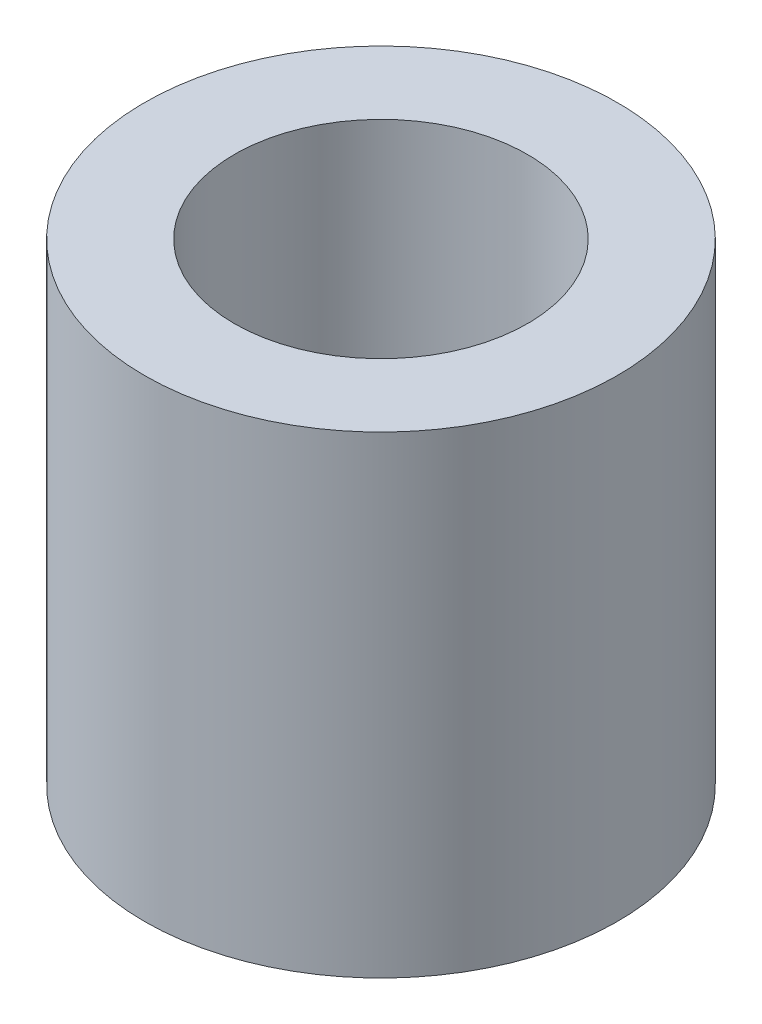
ISO-10303-21;
HEADER;
FILE_DESCRIPTION(('STEP AP214'),'2;1');
FILE_NAME('part.step','',(''),(''),'','','');
FILE_SCHEMA(('AUTOMOTIVE_DESIGN { 1 0 10303 214 1 1 1 1 }'));
ENDSEC;
DATA;
#1=APPLICATION_CONTEXT('core data for automotive mechanical design processes');
#2=APPLICATION_PROTOCOL_DEFINITION('international standard','automotive_design',2000,#1);
#3=PRODUCT_CONTEXT('',#1,'mechanical');
#4=PRODUCT('Part','Part','',(#3));
#5=PRODUCT_RELATED_PRODUCT_CATEGORY('part','',(#4));
#6=PRODUCT_DEFINITION_FORMATION('','',#4);
#7=PRODUCT_DEFINITION_CONTEXT('part definition',#1,'design');
#8=PRODUCT_DEFINITION('design','',#6,#7);
#9=PRODUCT_DEFINITION_SHAPE('','',#8);
#10=(LENGTH_UNIT() NAMED_UNIT(*) SI_UNIT(.MILLI.,.METRE.));
#11=(NAMED_UNIT(*) PLANE_ANGLE_UNIT() SI_UNIT($,.RADIAN.));
#12=(NAMED_UNIT(*) SI_UNIT($,.STERADIAN.) SOLID_ANGLE_UNIT());
#13=UNCERTAINTY_MEASURE_WITH_UNIT(LENGTH_MEASURE(1.E-05),#10,'distance_accuracy_value','');
#14=(GEOMETRIC_REPRESENTATION_CONTEXT(3) GLOBAL_UNCERTAINTY_ASSIGNED_CONTEXT((#13)) GLOBAL_UNIT_ASSIGNED_CONTEXT((#10,
#11,#12)) REPRESENTATION_CONTEXT('',''));
#15=CARTESIAN_POINT('',(0.,0.,0.));
#16=DIRECTION('',(0.,0.,1.));
#17=DIRECTION('',(1.,0.,0.));
#18=AXIS2_PLACEMENT_3D('',#15,#16,#17);
#19=CARTESIAN_POINT('',(0.,10.,0.));
#20=DIRECTION('',(0.,1.,0.));
#21=DIRECTION('',(0.,0.,1.));
#22=AXIS2_PLACEMENT_3D('',#19,#20,#21);
#23=PLANE('',#22);
#24=CARTESIAN_POINT('',(0.,10.,0.));
#25=DIRECTION('',(0.,1.,0.));
#26=DIRECTION('',(0.,0.,1.));
#27=AXIS2_PLACEMENT_3D('',#24,#25,#26);
#28=CIRCLE('',#27,5.);
#29=CARTESIAN_POINT('',(0.,10.,5.));
#30=VERTEX_POINT('',#29);
#31=EDGE_CURVE('E10',#30,#30,#28,.T.);
#32=ORIENTED_EDGE('',*,*,#31,.T.);
#33=EDGE_LOOP('',(#32));
#34=FACE_BOUND('',#33,.T.);
#35=CARTESIAN_POINT('',(0.,10.,0.));
#36=DIRECTION('',(0.,1.,0.));
#37=DIRECTION('',(0.,0.,1.));
#38=AXIS2_PLACEMENT_3D('',#35,#36,#37);
#39=CIRCLE('',#38,3.1);
#40=CARTESIAN_POINT('',(0.,10.,3.1));
#41=VERTEX_POINT('',#40);
#42=EDGE_CURVE('E50',#41,#41,#39,.T.);
#43=ORIENTED_EDGE('',*,*,#42,.F.);
#44=EDGE_LOOP('',(#43));
#45=FACE_BOUND('',#44,.T.);
#46=ADVANCED_FACE('F37',(#34,#45),#23,.T.);
#47=CARTESIAN_POINT('',(0.,0.,0.));
#48=DIRECTION('',(0.,1.,0.));
#49=DIRECTION('',(0.,0.,1.));
#50=AXIS2_PLACEMENT_3D('',#47,#48,#49);
#51=PLANE('',#50);
#52=CARTESIAN_POINT('',(0.,0.,0.));
#53=DIRECTION('',(0.,1.,0.));
#54=DIRECTION('',(0.,0.,1.));
#55=AXIS2_PLACEMENT_3D('',#52,#53,#54);
#56=CIRCLE('',#55,5.);
#57=CARTESIAN_POINT('',(0.,0.,5.));
#58=VERTEX_POINT('',#57);
#59=EDGE_CURVE('E41',#58,#58,#56,.T.);
#60=ORIENTED_EDGE('',*,*,#59,.F.);
#61=EDGE_LOOP('',(#60));
#62=FACE_BOUND('',#61,.T.);
#63=CARTESIAN_POINT('',(0.,0.,0.));
#64=DIRECTION('',(0.,1.,0.));
#65=DIRECTION('',(0.,0.,1.));
#66=AXIS2_PLACEMENT_3D('',#63,#64,#65);
#67=CIRCLE('',#66,3.1);
#68=CARTESIAN_POINT('',(0.,0.,3.1));
#69=VERTEX_POINT('',#68);
#70=EDGE_CURVE('E52',#69,#69,#67,.T.);
#71=ORIENTED_EDGE('',*,*,#70,.T.);
#72=EDGE_LOOP('',(#71));
#73=FACE_BOUND('',#72,.T.);
#74=ADVANCED_FACE('F64',(#62,#73),#51,.F.);
#75=CARTESIAN_POINT('',(0.,10.,0.));
#76=DIRECTION('',(0.,-1.,0.));
#77=DIRECTION('',(0.,0.,-1.));
#78=AXIS2_PLACEMENT_3D('',#75,#76,#77);
#79=CYLINDRICAL_SURFACE('',#78,5.);
#80=ORIENTED_EDGE('',*,*,#31,.F.);
#81=EDGE_LOOP('',(#80));
#82=FACE_BOUND('',#81,.T.);
#83=ORIENTED_EDGE('',*,*,#59,.T.);
#84=EDGE_LOOP('',(#83));
#85=FACE_BOUND('',#84,.T.);
#86=ADVANCED_FACE('F39',(#82,#85),#79,.T.);
#87=CARTESIAN_POINT('',(0.,10.,0.));
#88=DIRECTION('',(0.,-1.,0.));
#89=DIRECTION('',(0.,0.,-1.));
#90=AXIS2_PLACEMENT_3D('',#87,#88,#89);
#91=CYLINDRICAL_SURFACE('',#90,3.1);
#92=ORIENTED_EDGE('',*,*,#42,.T.);
#93=EDGE_LOOP('',(#92));
#94=FACE_BOUND('',#93,.T.);
#95=ORIENTED_EDGE('',*,*,#70,.F.);
#96=EDGE_LOOP('',(#95));
#97=FACE_BOUND('',#96,.T.);
#98=ADVANCED_FACE('F60',(#94,#97),#91,.F.);
#99=CLOSED_SHELL('',(#46,#74,#86,#98));
#100=MANIFOLD_SOLID_BREP('B2',#99);
#101=ADVANCED_BREP_SHAPE_REPRESENTATION('',(#18,#100),#14);
#102=SHAPE_DEFINITION_REPRESENTATION(#9,#101);
ENDSEC;
END-ISO-10303-21;
